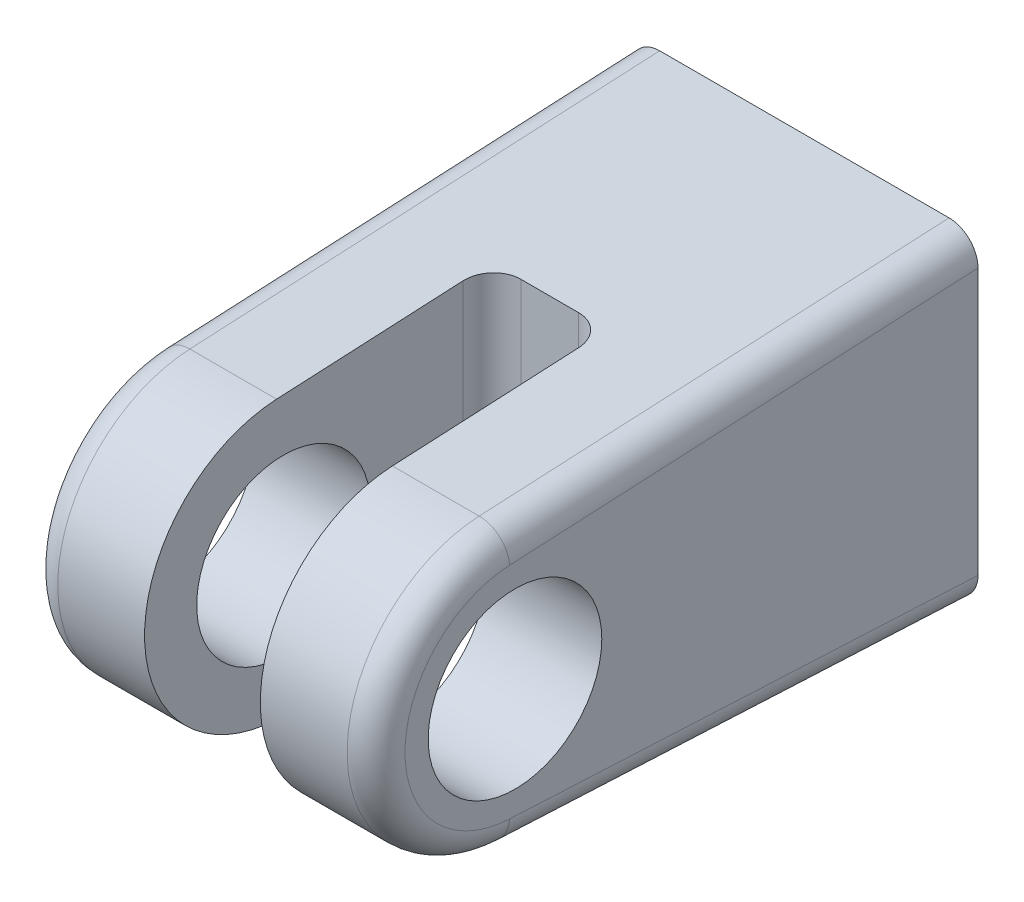
ISO-10303-21;
HEADER;
FILE_DESCRIPTION(('STEP AP214'),'2;1');
FILE_NAME('part.step','',(''),(''),'','','');
FILE_SCHEMA(('AUTOMOTIVE_DESIGN { 1 0 10303 214 1 1 1 1 }'));
ENDSEC;
DATA;
#1=APPLICATION_CONTEXT('core data for automotive mechanical design processes');
#2=APPLICATION_PROTOCOL_DEFINITION('international standard','automotive_design',2000,#1);
#3=PRODUCT_CONTEXT('',#1,'mechanical');
#4=PRODUCT('Part','Part','',(#3));
#5=PRODUCT_RELATED_PRODUCT_CATEGORY('part','',(#4));
#6=PRODUCT_DEFINITION_FORMATION('','',#4);
#7=PRODUCT_DEFINITION_CONTEXT('part definition',#1,'design');
#8=PRODUCT_DEFINITION('design','',#6,#7);
#9=PRODUCT_DEFINITION_SHAPE('','',#8);
#10=(LENGTH_UNIT() NAMED_UNIT(*) SI_UNIT(.MILLI.,.METRE.));
#11=(NAMED_UNIT(*) PLANE_ANGLE_UNIT() SI_UNIT($,.RADIAN.));
#12=(NAMED_UNIT(*) SI_UNIT($,.STERADIAN.) SOLID_ANGLE_UNIT());
#13=UNCERTAINTY_MEASURE_WITH_UNIT(LENGTH_MEASURE(1.E-05),#10,'distance_accuracy_value','');
#14=(GEOMETRIC_REPRESENTATION_CONTEXT(3) GLOBAL_UNCERTAINTY_ASSIGNED_CONTEXT((#13)) GLOBAL_UNIT_ASSIGNED_CONTEXT((#10,
#11,#12)) REPRESENTATION_CONTEXT('',''));
#15=CARTESIAN_POINT('',(0.,0.,0.));
#16=DIRECTION('',(0.,0.,1.));
#17=DIRECTION('',(1.,0.,0.));
#18=AXIS2_PLACEMENT_3D('',#15,#16,#17);
#19=CARTESIAN_POINT('',(9.525,0.,25.4));
#20=DIRECTION('',(-1.,0.,0.));
#21=DIRECTION('',(0.,0.,1.));
#22=AXIS2_PLACEMENT_3D('',#19,#20,#21);
#23=CYLINDRICAL_SURFACE('',#22,7.62);
#24=DIRECTION('',(-1.,0.,0.));
#25=VECTOR('',#24,1.);
#26=CARTESIAN_POINT('',(9.525,-7.61063246853942,25.7777213639888));
#27=LINE('',#26,#25);
#28=CARTESIAN_POINT('',(7.9375,-7.61063246853942,25.7777213639888));
#29=VERTEX_POINT('',#28);
#30=CARTESIAN_POINT('',(3.175,-7.61063246853942,25.7777213639888));
#31=VERTEX_POINT('',#30);
#32=EDGE_CURVE('E137',#29,#31,#27,.T.);
#33=ORIENTED_EDGE('',*,*,#32,.F.);
#34=CARTESIAN_POINT('',(7.9375,0.,25.4));
#35=DIRECTION('',(1.,0.,0.));
#36=DIRECTION('',(0.,0.,-1.));
#37=AXIS2_PLACEMENT_3D('',#34,#35,#36);
#38=CIRCLE('',#37,7.62);
#39=CARTESIAN_POINT('',(7.9375,7.61063246853942,25.7777213639888));
#40=VERTEX_POINT('',#39);
#41=EDGE_CURVE('E205',#29,#40,#38,.F.);
#42=ORIENTED_EDGE('',*,*,#41,.T.);
#43=DIRECTION('',(-1.,0.,0.));
#44=VECTOR('',#43,1.);
#45=CARTESIAN_POINT('',(9.525,7.61063246853942,25.7777213639888));
#46=LINE('',#45,#44);
#47=CARTESIAN_POINT('',(3.175,7.61063246853942,25.7777213639888));
#48=VERTEX_POINT('',#47);
#49=EDGE_CURVE('E156',#40,#48,#46,.T.);
#50=ORIENTED_EDGE('',*,*,#49,.T.);
#51=CARTESIAN_POINT('',(3.175,0.,25.4));
#52=DIRECTION('',(1.,0.,0.));
#53=DIRECTION('',(0.,0.,-1.));
#54=AXIS2_PLACEMENT_3D('',#51,#52,#53);
#55=CIRCLE('',#54,7.62);
#56=EDGE_CURVE('E154',#48,#31,#55,.T.);
#57=ORIENTED_EDGE('',*,*,#56,.T.);
#58=EDGE_LOOP('',(#33,#42,#50,#57));
#59=FACE_BOUND('',#58,.T.);
#60=ADVANCED_FACE('F36',(#59),#23,.T.);
#61=CARTESIAN_POINT('',(9.525,8.89,0.));
#62=DIRECTION('',(0.,0.,1.));
#63=DIRECTION('',(0.,-1.,0.));
#64=AXIS2_PLACEMENT_3D('',#61,#62,#63);
#65=PLANE('',#64);
#66=CARTESIAN_POINT('',(0.,0.,0.));
#67=DIRECTION('',(0.,0.,-1.));
#68=DIRECTION('',(0.,1.,0.));
#69=AXIS2_PLACEMENT_3D('',#66,#67,#68);
#70=CIRCLE('',#69,6.35);
#71=CARTESIAN_POINT('',(0.,6.35,0.));
#72=VERTEX_POINT('',#71);
#73=EDGE_CURVE('E229',#72,#72,#70,.T.);
#74=ORIENTED_EDGE('',*,*,#73,.F.);
#75=EDGE_LOOP('',(#74));
#76=FACE_BOUND('',#75,.T.);
#77=DIRECTION('',(-1.,0.,0.));
#78=VECTOR('',#77,1.);
#79=CARTESIAN_POINT('',(9.525,-8.89,0.));
#80=LINE('',#79,#78);
#81=CARTESIAN_POINT('',(7.9375,-8.89,0.));
#82=VERTEX_POINT('',#81);
#83=CARTESIAN_POINT('',(-7.93749999999999,-8.89,0.));
#84=VERTEX_POINT('',#83);
#85=EDGE_CURVE('E272',#82,#84,#80,.T.);
#86=ORIENTED_EDGE('',*,*,#85,.T.);
#87=CARTESIAN_POINT('',(-7.9375,-7.30054602886092,0.));
#88=DIRECTION('',(0.,0.,1.));
#89=DIRECTION('',(0.,-1.,0.));
#90=AXIS2_PLACEMENT_3D('',#87,#88,#89);
#91=ELLIPSE('',#90,1.58945397113908,1.5875);
#92=CARTESIAN_POINT('',(-9.525,-7.30054602886092,0.));
#93=VERTEX_POINT('',#92);
#94=EDGE_CURVE('E188',#84,#93,#91,.F.);
#95=ORIENTED_EDGE('',*,*,#94,.T.);
#96=DIRECTION('',(0.,1.,0.));
#97=VECTOR('',#96,1.);
#98=CARTESIAN_POINT('',(-9.525,8.89,0.));
#99=LINE('',#98,#97);
#100=CARTESIAN_POINT('',(-9.525,7.30054602886092,0.));
#101=VERTEX_POINT('',#100);
#102=EDGE_CURVE('E256',#93,#101,#99,.T.);
#103=ORIENTED_EDGE('',*,*,#102,.T.);
#104=CARTESIAN_POINT('',(-7.9375,7.30054602886092,0.));
#105=DIRECTION('',(0.,0.,1.));
#106=DIRECTION('',(0.,-1.,0.));
#107=AXIS2_PLACEMENT_3D('',#104,#105,#106);
#108=ELLIPSE('',#107,1.58945397113908,1.5875);
#109=CARTESIAN_POINT('',(-7.93749999999999,8.89,0.));
#110=VERTEX_POINT('',#109);
#111=EDGE_CURVE('E184',#101,#110,#108,.F.);
#112=ORIENTED_EDGE('',*,*,#111,.T.);
#113=DIRECTION('',(-1.,0.,0.));
#114=VECTOR('',#113,1.);
#115=CARTESIAN_POINT('',(9.525,8.89,0.));
#116=LINE('',#115,#114);
#117=CARTESIAN_POINT('',(7.9375,8.89,0.));
#118=VERTEX_POINT('',#117);
#119=EDGE_CURVE('E164',#118,#110,#116,.T.);
#120=ORIENTED_EDGE('',*,*,#119,.F.);
#121=CARTESIAN_POINT('',(7.9375,7.30054602886092,0.));
#122=DIRECTION('',(0.,0.,1.));
#123=DIRECTION('',(0.,1.,0.));
#124=AXIS2_PLACEMENT_3D('',#121,#122,#123);
#125=ELLIPSE('',#124,1.58945397113908,1.5875);
#126=CARTESIAN_POINT('',(9.525,7.30054602886092,0.));
#127=VERTEX_POINT('',#126);
#128=EDGE_CURVE('E182',#118,#127,#125,.F.);
#129=ORIENTED_EDGE('',*,*,#128,.T.);
#130=DIRECTION('',(0.,1.,0.));
#131=VECTOR('',#130,1.);
#132=CARTESIAN_POINT('',(9.525,8.89,0.));
#133=LINE('',#132,#131);
#134=CARTESIAN_POINT('',(9.525,-7.30054602886092,0.));
#135=VERTEX_POINT('',#134);
#136=EDGE_CURVE('E274',#135,#127,#133,.T.);
#137=ORIENTED_EDGE('',*,*,#136,.F.);
#138=CARTESIAN_POINT('',(7.9375,-7.30054602886092,0.));
#139=DIRECTION('',(0.,0.,1.));
#140=DIRECTION('',(0.,1.,0.));
#141=AXIS2_PLACEMENT_3D('',#138,#139,#140);
#142=ELLIPSE('',#141,1.58945397113908,1.5875);
#143=EDGE_CURVE('E186',#135,#82,#142,.F.);
#144=ORIENTED_EDGE('',*,*,#143,.T.);
#145=EDGE_LOOP('',(#86,#95,#103,#112,#120,#129,#137,#144));
#146=FACE_BOUND('',#145,.T.);
#147=ADVANCED_FACE('F250',(#76,#146),#65,.F.);
#148=CARTESIAN_POINT('',(9.525,8.89,0.));
#149=DIRECTION('',(0.,-0.998770665162654,-0.0495697328069288));
#150=DIRECTION('',(0.,0.0495697328069289,-0.998770665162654));
#151=AXIS2_PLACEMENT_3D('',#148,#149,#150);
#152=PLANE('',#151);
#153=ORIENTED_EDGE('',*,*,#119,.T.);
#154=DIRECTION('',(0.,-0.0495697328069289,0.998770665162654));
#155=VECTOR('',#154,1.);
#156=CARTESIAN_POINT('',(-7.9375,8.89,0.));
#157=LINE('',#156,#155);
#158=CARTESIAN_POINT('',(-7.93749999999999,7.61063246853942,25.7777213639888));
#159=VERTEX_POINT('',#158);
#160=EDGE_CURVE('E217',#110,#159,#157,.T.);
#161=ORIENTED_EDGE('',*,*,#160,.T.);
#162=CARTESIAN_POINT('',(-3.175,7.61063246853942,25.7777213639888));
#163=VERTEX_POINT('',#162);
#164=EDGE_CURVE('E149',#163,#159,#46,.T.);
#165=ORIENTED_EDGE('',*,*,#164,.F.);
#166=DIRECTION('',(0.,0.0495697328069289,-0.998770665162654));
#167=VECTOR('',#166,1.);
#168=CARTESIAN_POINT('',(-3.17500000000001,8.89,0.));
#169=LINE('',#168,#167);
#170=CARTESIAN_POINT('',(-3.175,8.11786967514889,15.5575));
#171=VERTEX_POINT('',#170);
#172=EDGE_CURVE('E276',#163,#171,#169,.T.);
#173=ORIENTED_EDGE('',*,*,#172,.T.);
#174=CARTESIAN_POINT('',(-1.5875,8.11786967514889,15.5575));
#175=DIRECTION('',(0.,-0.998770665162654,-0.0495697328069288));
#176=DIRECTION('',(0.,-0.0495697328069289,0.998770665162654));
#177=AXIS2_PLACEMENT_3D('',#174,#175,#176);
#178=ELLIPSE('',#177,1.58945397113908,1.5875);
#179=CARTESIAN_POINT('',(-1.5875,8.19665848380717,13.97));
#180=VERTEX_POINT('',#179);
#181=EDGE_CURVE('E219',#171,#180,#178,.T.);
#182=ORIENTED_EDGE('',*,*,#181,.T.);
#183=DIRECTION('',(1.,0.,0.));
#184=VECTOR('',#183,1.);
#185=CARTESIAN_POINT('',(9.525,8.19665848380717,13.97));
#186=LINE('',#185,#184);
#187=CARTESIAN_POINT('',(1.5875,8.19665848380717,13.97));
#188=VERTEX_POINT('',#187);
#189=EDGE_CURVE('E280',#180,#188,#186,.T.);
#190=ORIENTED_EDGE('',*,*,#189,.T.);
#191=CARTESIAN_POINT('',(1.5875,8.11786967514889,15.5575));
#192=DIRECTION('',(0.,-0.998770665162654,-0.0495697328069288));
#193=DIRECTION('',(0.,-0.0495697328069289,0.998770665162654));
#194=AXIS2_PLACEMENT_3D('',#191,#192,#193);
#195=ELLIPSE('',#194,1.58945397113908,1.5875);
#196=CARTESIAN_POINT('',(3.175,8.11786967514889,15.5575));
#197=VERTEX_POINT('',#196);
#198=EDGE_CURVE('E45',#188,#197,#195,.T.);
#199=ORIENTED_EDGE('',*,*,#198,.T.);
#200=DIRECTION('',(0.,-0.0495697328069289,0.998770665162654));
#201=VECTOR('',#200,1.);
#202=CARTESIAN_POINT('',(3.175,8.89,0.));
#203=LINE('',#202,#201);
#204=EDGE_CURVE('E158',#197,#48,#203,.T.);
#205=ORIENTED_EDGE('',*,*,#204,.T.);
#206=ORIENTED_EDGE('',*,*,#49,.F.);
#207=DIRECTION('',(0.,-0.0495697328069289,0.998770665162654));
#208=VECTOR('',#207,1.);
#209=CARTESIAN_POINT('',(7.9375,8.89,0.));
#210=LINE('',#209,#208);
#211=EDGE_CURVE('E215',#40,#118,#210,.F.);
#212=ORIENTED_EDGE('',*,*,#211,.T.);
#213=EDGE_LOOP('',(#153,#161,#165,#173,#182,#190,#199,#205,#206,#212));
#214=FACE_BOUND('',#213,.T.);
#215=ADVANCED_FACE('F246',(#214),#152,.F.);
#216=ORIENTED_EDGE('',*,*,#164,.T.);
#217=CARTESIAN_POINT('',(-7.9375,0.,25.4));
#218=DIRECTION('',(1.,0.,0.));
#219=DIRECTION('',(0.,0.,-1.));
#220=AXIS2_PLACEMENT_3D('',#217,#218,#219);
#221=CIRCLE('',#220,7.62);
#222=CARTESIAN_POINT('',(-7.93749999999999,-7.61063246853942,25.7777213639888));
#223=VERTEX_POINT('',#222);
#224=EDGE_CURVE('E196',#159,#223,#221,.T.);
#225=ORIENTED_EDGE('',*,*,#224,.T.);
#226=CARTESIAN_POINT('',(-3.175,-7.61063246853942,25.7777213639888));
#227=VERTEX_POINT('',#226);
#228=EDGE_CURVE('E150',#227,#223,#27,.T.);
#229=ORIENTED_EDGE('',*,*,#228,.F.);
#230=CARTESIAN_POINT('',(-3.175,0.,25.4));
#231=DIRECTION('',(-1.,0.,0.));
#232=DIRECTION('',(0.,0.,1.));
#233=AXIS2_PLACEMENT_3D('',#230,#231,#232);
#234=CIRCLE('',#233,7.62);
#235=EDGE_CURVE('E270',#227,#163,#234,.T.);
#236=ORIENTED_EDGE('',*,*,#235,.T.);
#237=EDGE_LOOP('',(#216,#225,#229,#236));
#238=FACE_BOUND('',#237,.T.);
#239=ADVANCED_FACE('F267',(#238),#23,.T.);
#240=CARTESIAN_POINT('',(9.525,-8.89,0.));
#241=DIRECTION('',(0.,0.998770665162654,-0.0495697328069286));
#242=DIRECTION('',(0.,0.0495697328069286,0.998770665162654));
#243=AXIS2_PLACEMENT_3D('',#240,#241,#242);
#244=PLANE('',#243);
#245=ORIENTED_EDGE('',*,*,#228,.T.);
#246=DIRECTION('',(0.,-0.0495697328069286,-0.998770665162654));
#247=VECTOR('',#246,1.);
#248=CARTESIAN_POINT('',(-7.9375,-8.89,0.));
#249=LINE('',#248,#247);
#250=EDGE_CURVE('E179',#223,#84,#249,.T.);
#251=ORIENTED_EDGE('',*,*,#250,.T.);
#252=ORIENTED_EDGE('',*,*,#85,.F.);
#253=DIRECTION('',(0.,-0.0495697328069286,-0.998770665162654));
#254=VECTOR('',#253,1.);
#255=CARTESIAN_POINT('',(7.9375,-7.61063246853942,25.7777213639888));
#256=LINE('',#255,#254);
#257=EDGE_CURVE('E146',#82,#29,#256,.F.);
#258=ORIENTED_EDGE('',*,*,#257,.T.);
#259=ORIENTED_EDGE('',*,*,#32,.T.);
#260=DIRECTION('',(0.,-0.0495697328069286,-0.998770665162654));
#261=VECTOR('',#260,1.);
#262=CARTESIAN_POINT('',(3.175,-8.89,0.));
#263=LINE('',#262,#261);
#264=CARTESIAN_POINT('',(3.175,-8.1178696751489,15.5575));
#265=VERTEX_POINT('',#264);
#266=EDGE_CURVE('E142',#31,#265,#263,.T.);
#267=ORIENTED_EDGE('',*,*,#266,.T.);
#268=CARTESIAN_POINT('',(1.5875,-8.1178696751489,15.5575));
#269=DIRECTION('',(0.,0.998770665162654,-0.0495697328069286));
#270=DIRECTION('',(0.,-0.0495697328069286,-0.998770665162654));
#271=AXIS2_PLACEMENT_3D('',#268,#269,#270);
#272=ELLIPSE('',#271,1.58945397113908,1.5875);
#273=CARTESIAN_POINT('',(1.5875,-8.19665848380717,13.97));
#274=VERTEX_POINT('',#273);
#275=EDGE_CURVE('E11',#265,#274,#272,.T.);
#276=ORIENTED_EDGE('',*,*,#275,.T.);
#277=DIRECTION('',(-1.,0.,0.));
#278=VECTOR('',#277,1.);
#279=CARTESIAN_POINT('',(9.525,-8.19665848380717,13.97));
#280=LINE('',#279,#278);
#281=CARTESIAN_POINT('',(-1.5875,-8.19665848380717,13.97));
#282=VERTEX_POINT('',#281);
#283=EDGE_CURVE('E163',#274,#282,#280,.T.);
#284=ORIENTED_EDGE('',*,*,#283,.T.);
#285=CARTESIAN_POINT('',(-1.5875,-8.1178696751489,15.5575));
#286=DIRECTION('',(0.,0.998770665162654,-0.0495697328069286));
#287=DIRECTION('',(0.,-0.0495697328069286,-0.998770665162654));
#288=AXIS2_PLACEMENT_3D('',#285,#286,#287);
#289=ELLIPSE('',#288,1.58945397113908,1.5875);
#290=CARTESIAN_POINT('',(-3.175,-8.1178696751489,15.5575));
#291=VERTEX_POINT('',#290);
#292=EDGE_CURVE('E221',#282,#291,#289,.T.);
#293=ORIENTED_EDGE('',*,*,#292,.T.);
#294=DIRECTION('',(0.,0.0495697328069286,0.998770665162654));
#295=VECTOR('',#294,1.);
#296=CARTESIAN_POINT('',(-3.17500000000001,-8.89,0.));
#297=LINE('',#296,#295);
#298=EDGE_CURVE('E167',#291,#227,#297,.T.);
#299=ORIENTED_EDGE('',*,*,#298,.T.);
#300=EDGE_LOOP('',(#245,#251,#252,#258,#259,#267,#276,#284,#293,#299));
#301=FACE_BOUND('',#300,.T.);
#302=ADVANCED_FACE('F140',(#301),#244,.F.);
#303=CARTESIAN_POINT('',(9.525,0.,25.4));
#304=DIRECTION('',(1.,0.,0.));
#305=DIRECTION('',(0.,0.,-1.));
#306=AXIS2_PLACEMENT_3D('',#303,#304,#305);
#307=PLANE('',#306);
#308=CARTESIAN_POINT('',(9.525,0.,25.4));
#309=DIRECTION('',(1.,0.,0.));
#310=DIRECTION('',(0.,0.,-1.));
#311=AXIS2_PLACEMENT_3D('',#308,#309,#310);
#312=CIRCLE('',#311,4.7625);
#313=CARTESIAN_POINT('',(9.525,0.,20.6375));
#314=VERTEX_POINT('',#313);
#315=EDGE_CURVE('E285',#314,#314,#312,.T.);
#316=ORIENTED_EDGE('',*,*,#315,.F.);
#317=EDGE_LOOP('',(#316));
#318=FACE_BOUND('',#317,.T.);
#319=CARTESIAN_POINT('',(9.525,0.,25.4));
#320=DIRECTION('',(1.,0.,0.));
#321=DIRECTION('',(0.,0.,-1.));
#322=AXIS2_PLACEMENT_3D('',#319,#320,#321);
#323=CIRCLE('',#322,6.0325);
#324=CARTESIAN_POINT('',(9.525,6.0250840375937,25.6990294131578));
#325=VERTEX_POINT('',#324);
#326=CARTESIAN_POINT('',(9.525,-6.02508403759371,25.6990294131578));
#327=VERTEX_POINT('',#326);
#328=EDGE_CURVE('E200',#325,#327,#323,.T.);
#329=ORIENTED_EDGE('',*,*,#328,.T.);
#330=DIRECTION('',(0.,-0.0495697328069286,-0.998770665162654));
#331=VECTOR('',#330,1.);
#332=CARTESIAN_POINT('',(9.525,-7.30445156905429,-0.0786919508310134));
#333=LINE('',#332,#331);
#334=EDGE_CURVE('E202',#327,#135,#333,.T.);
#335=ORIENTED_EDGE('',*,*,#334,.T.);
#336=ORIENTED_EDGE('',*,*,#136,.T.);
#337=DIRECTION('',(0.,-0.0495697328069289,0.998770665162654));
#338=VECTOR('',#337,1.);
#339=CARTESIAN_POINT('',(9.525,6.0250840375937,25.6990294131578));
#340=LINE('',#339,#338);
#341=EDGE_CURVE('E198',#127,#325,#340,.T.);
#342=ORIENTED_EDGE('',*,*,#341,.T.);
#343=EDGE_LOOP('',(#329,#335,#336,#342));
#344=FACE_BOUND('',#343,.T.);
#345=ADVANCED_FACE('F350',(#318,#344),#307,.T.);
#346=CARTESIAN_POINT('',(-9.525,0.,25.4));
#347=DIRECTION('',(1.,0.,0.));
#348=DIRECTION('',(0.,0.,-1.));
#349=AXIS2_PLACEMENT_3D('',#346,#347,#348);
#350=PLANE('',#349);
#351=CARTESIAN_POINT('',(-9.525,0.,25.4));
#352=DIRECTION('',(1.,0.,0.));
#353=DIRECTION('',(0.,0.,-1.));
#354=AXIS2_PLACEMENT_3D('',#351,#352,#353);
#355=CIRCLE('',#354,4.7625);
#356=CARTESIAN_POINT('',(-9.525,0.,20.6375));
#357=VERTEX_POINT('',#356);
#358=EDGE_CURVE('E177',#357,#357,#355,.T.);
#359=ORIENTED_EDGE('',*,*,#358,.T.);
#360=EDGE_LOOP('',(#359));
#361=FACE_BOUND('',#360,.T.);
#362=ORIENTED_EDGE('',*,*,#102,.F.);
#363=DIRECTION('',(0.,-0.0495697328069286,-0.998770665162654));
#364=VECTOR('',#363,1.);
#365=CARTESIAN_POINT('',(-9.525,-6.02508403759371,25.6990294131578));
#366=LINE('',#365,#364);
#367=CARTESIAN_POINT('',(-9.525,-6.02508403759371,25.6990294131578));
#368=VERTEX_POINT('',#367);
#369=EDGE_CURVE('E194',#93,#368,#366,.F.);
#370=ORIENTED_EDGE('',*,*,#369,.T.);
#371=CARTESIAN_POINT('',(-9.525,0.,25.4));
#372=DIRECTION('',(1.,0.,0.));
#373=DIRECTION('',(0.,0.,-1.));
#374=AXIS2_PLACEMENT_3D('',#371,#372,#373);
#375=CIRCLE('',#374,6.0325);
#376=CARTESIAN_POINT('',(-9.525,6.02508403759371,25.6990294131578));
#377=VERTEX_POINT('',#376);
#378=EDGE_CURVE('E192',#368,#377,#375,.F.);
#379=ORIENTED_EDGE('',*,*,#378,.T.);
#380=DIRECTION('',(0.,-0.0495697328069289,0.998770665162654));
#381=VECTOR('',#380,1.);
#382=CARTESIAN_POINT('',(-9.525,6.0250840375937,25.6990294131578));
#383=LINE('',#382,#381);
#384=EDGE_CURVE('E190',#377,#101,#383,.F.);
#385=ORIENTED_EDGE('',*,*,#384,.T.);
#386=EDGE_LOOP('',(#362,#370,#379,#385));
#387=FACE_BOUND('',#386,.T.);
#388=ADVANCED_FACE('F348',(#361,#387),#350,.F.);
#389=CARTESIAN_POINT('',(-3.175,-8.89,13.97));
#390=DIRECTION('',(-1.,0.,0.));
#391=DIRECTION('',(0.,0.,1.));
#392=AXIS2_PLACEMENT_3D('',#389,#390,#391);
#393=PLANE('',#392);
#394=CARTESIAN_POINT('',(-3.175,0.,25.4));
#395=DIRECTION('',(-1.,0.,0.));
#396=DIRECTION('',(0.,0.,1.));
#397=AXIS2_PLACEMENT_3D('',#394,#395,#396);
#398=CIRCLE('',#397,4.7625);
#399=CARTESIAN_POINT('',(-3.175,0.,20.6375));
#400=VERTEX_POINT('',#399);
#401=EDGE_CURVE('E159',#400,#400,#398,.T.);
#402=ORIENTED_EDGE('',*,*,#401,.T.);
#403=EDGE_LOOP('',(#402));
#404=FACE_BOUND('',#403,.T.);
#405=ORIENTED_EDGE('',*,*,#298,.F.);
#406=DIRECTION('',(0.,1.,0.));
#407=VECTOR('',#406,1.);
#408=CARTESIAN_POINT('',(-3.175,8.19665848380717,15.5575));
#409=LINE('',#408,#407);
#410=EDGE_CURVE('E207',#291,#171,#409,.T.);
#411=ORIENTED_EDGE('',*,*,#410,.T.);
#412=ORIENTED_EDGE('',*,*,#172,.F.);
#413=ORIENTED_EDGE('',*,*,#235,.F.);
#414=EDGE_LOOP('',(#405,#411,#412,#413));
#415=FACE_BOUND('',#414,.T.);
#416=ADVANCED_FACE('F342',(#404,#415),#393,.F.);
#417=CARTESIAN_POINT('',(-3.175,-8.89,13.97));
#418=DIRECTION('',(0.,0.,-1.));
#419=DIRECTION('',(-1.,0.,0.));
#420=AXIS2_PLACEMENT_3D('',#417,#418,#419);
#421=PLANE('',#420);
#422=ORIENTED_EDGE('',*,*,#189,.F.);
#423=DIRECTION('',(0.,1.,0.));
#424=VECTOR('',#423,1.);
#425=CARTESIAN_POINT('',(-1.5875,-8.19665848380717,13.97));
#426=LINE('',#425,#424);
#427=EDGE_CURVE('E212',#180,#282,#426,.F.);
#428=ORIENTED_EDGE('',*,*,#427,.T.);
#429=ORIENTED_EDGE('',*,*,#283,.F.);
#430=DIRECTION('',(0.,1.,0.));
#431=VECTOR('',#430,1.);
#432=CARTESIAN_POINT('',(1.5875,8.19665848380717,13.97));
#433=LINE('',#432,#431);
#434=EDGE_CURVE('E210',#274,#188,#433,.T.);
#435=ORIENTED_EDGE('',*,*,#434,.T.);
#436=EDGE_LOOP('',(#422,#428,#429,#435));
#437=FACE_BOUND('',#436,.T.);
#438=ADVANCED_FACE('F357',(#437),#421,.F.);
#439=CARTESIAN_POINT('',(3.175,-8.89,13.97));
#440=DIRECTION('',(1.,0.,0.));
#441=DIRECTION('',(0.,0.,-1.));
#442=AXIS2_PLACEMENT_3D('',#439,#440,#441);
#443=PLANE('',#442);
#444=CARTESIAN_POINT('',(3.175,0.,25.4));
#445=DIRECTION('',(1.,0.,0.));
#446=DIRECTION('',(0.,0.,-1.));
#447=AXIS2_PLACEMENT_3D('',#444,#445,#446);
#448=CIRCLE('',#447,4.7625);
#449=CARTESIAN_POINT('',(3.175,0.,20.6375));
#450=VERTEX_POINT('',#449);
#451=EDGE_CURVE('E174',#450,#450,#448,.T.);
#452=ORIENTED_EDGE('',*,*,#451,.T.);
#453=EDGE_LOOP('',(#452));
#454=FACE_BOUND('',#453,.T.);
#455=ORIENTED_EDGE('',*,*,#204,.F.);
#456=DIRECTION('',(0.,1.,0.));
#457=VECTOR('',#456,1.);
#458=CARTESIAN_POINT('',(3.175,-8.19665848380717,15.5575));
#459=LINE('',#458,#457);
#460=EDGE_CURVE('E162',#197,#265,#459,.F.);
#461=ORIENTED_EDGE('',*,*,#460,.T.);
#462=ORIENTED_EDGE('',*,*,#266,.F.);
#463=ORIENTED_EDGE('',*,*,#56,.F.);
#464=EDGE_LOOP('',(#455,#461,#462,#463));
#465=FACE_BOUND('',#464,.T.);
#466=ADVANCED_FACE('F161',(#454,#465),#443,.F.);
#467=CARTESIAN_POINT('',(-9.525,0.,25.4));
#468=DIRECTION('',(1.,0.,0.));
#469=DIRECTION('',(0.,0.,-1.));
#470=AXIS2_PLACEMENT_3D('',#467,#468,#469);
#471=CYLINDRICAL_SURFACE('',#470,4.7625);
#472=CARTESIAN_POINT('',(9.525,0.,20.6375));
#473=CARTESIAN_POINT('',(9.45885416666667,0.,20.6375));
#474=CARTESIAN_POINT('',(9.39270833333333,0.,20.6375));
#475=CARTESIAN_POINT('',(9.26041666666667,0.,20.6375));
#476=CARTESIAN_POINT('',(9.19427083333333,0.,20.6375));
#477=CARTESIAN_POINT('',(9.06197916666667,0.,20.6375));
#478=CARTESIAN_POINT('',(8.99583333333333,0.,20.6375));
#479=CARTESIAN_POINT('',(8.86354166666667,0.,20.6375));
#480=CARTESIAN_POINT('',(8.79739583333333,0.,20.6375));
#481=CARTESIAN_POINT('',(8.66510416666667,0.,20.6375));
#482=CARTESIAN_POINT('',(8.59895833333333,0.,20.6375));
#483=CARTESIAN_POINT('',(8.46666666666667,0.,20.6375));
#484=CARTESIAN_POINT('',(8.40052083333333,0.,20.6375));
#485=CARTESIAN_POINT('',(8.26822916666667,0.,20.6375));
#486=CARTESIAN_POINT('',(8.20208333333333,0.,20.6375));
#487=CARTESIAN_POINT('',(8.06979166666667,0.,20.6375));
#488=CARTESIAN_POINT('',(8.00364583333333,0.,20.6375));
#489=CARTESIAN_POINT('',(7.87135416666667,0.,20.6375));
#490=CARTESIAN_POINT('',(7.80520833333333,0.,20.6375));
#491=CARTESIAN_POINT('',(7.67291666666667,0.,20.6375));
#492=CARTESIAN_POINT('',(7.60677083333333,0.,20.6375));
#493=CARTESIAN_POINT('',(7.47447916666666,0.,20.6375));
#494=CARTESIAN_POINT('',(7.40833333333333,0.,20.6375));
#495=CARTESIAN_POINT('',(7.27604166666667,0.,20.6375));
#496=CARTESIAN_POINT('',(7.20989583333333,0.,20.6375));
#497=CARTESIAN_POINT('',(7.07760416666667,0.,20.6375));
#498=CARTESIAN_POINT('',(7.01145833333333,0.,20.6375));
#499=CARTESIAN_POINT('',(6.87916666666666,0.,20.6375));
#500=CARTESIAN_POINT('',(6.81302083333333,0.,20.6375));
#501=CARTESIAN_POINT('',(6.68072916666666,0.,20.6375));
#502=CARTESIAN_POINT('',(6.61458333333333,0.,20.6375));
#503=CARTESIAN_POINT('',(6.48229166666667,0.,20.6375));
#504=CARTESIAN_POINT('',(6.41614583333333,0.,20.6375));
#505=CARTESIAN_POINT('',(6.28385416666666,0.,20.6375));
#506=CARTESIAN_POINT('',(6.21770833333333,0.,20.6375));
#507=CARTESIAN_POINT('',(6.08541666666667,0.,20.6375));
#508=CARTESIAN_POINT('',(6.01927083333333,0.,20.6375));
#509=CARTESIAN_POINT('',(5.88697916666667,0.,20.6375));
#510=CARTESIAN_POINT('',(5.82083333333333,0.,20.6375));
#511=CARTESIAN_POINT('',(5.68854166666667,0.,20.6375));
#512=CARTESIAN_POINT('',(5.62239583333333,0.,20.6375));
#513=CARTESIAN_POINT('',(5.49010416666667,0.,20.6375));
#514=CARTESIAN_POINT('',(5.42395833333333,0.,20.6375));
#515=CARTESIAN_POINT('',(5.29166666666667,0.,20.6375));
#516=CARTESIAN_POINT('',(5.22552083333333,0.,20.6375));
#517=CARTESIAN_POINT('',(5.09322916666667,0.,20.6375));
#518=CARTESIAN_POINT('',(5.02708333333333,0.,20.6375));
#519=CARTESIAN_POINT('',(4.89479166666667,0.,20.6375));
#520=CARTESIAN_POINT('',(4.82864583333333,0.,20.6375));
#521=CARTESIAN_POINT('',(4.69635416666667,0.,20.6375));
#522=CARTESIAN_POINT('',(4.63020833333333,0.,20.6375));
#523=CARTESIAN_POINT('',(4.49791666666667,0.,20.6375));
#524=CARTESIAN_POINT('',(4.43177083333333,0.,20.6375));
#525=CARTESIAN_POINT('',(4.29947916666667,0.,20.6375));
#526=CARTESIAN_POINT('',(4.23333333333333,0.,20.6375));
#527=CARTESIAN_POINT('',(4.10104166666667,0.,20.6375));
#528=CARTESIAN_POINT('',(4.03489583333333,0.,20.6375));
#529=CARTESIAN_POINT('',(3.90260416666667,0.,20.6375));
#530=CARTESIAN_POINT('',(3.83645833333333,0.,20.6375));
#531=CARTESIAN_POINT('',(3.70416666666666,0.,20.6375));
#532=CARTESIAN_POINT('',(3.63802083333333,0.,20.6375));
#533=CARTESIAN_POINT('',(3.50572916666666,0.,20.6375));
#534=CARTESIAN_POINT('',(3.43958333333333,0.,20.6375));
#535=CARTESIAN_POINT('',(3.30729166666666,0.,20.6375));
#536=CARTESIAN_POINT('',(3.24114583333333,0.,20.6375));
#537=CARTESIAN_POINT('',(3.175,0.,20.6375));
#538=B_SPLINE_CURVE_WITH_KNOTS('',3,(#472,#473,#474,#475,#476,#477,#478,#479,#480,#481,#482,
#483,#484,#485,#486,#487,#488,#489,#490,#491,#492,#493,#494,#495,#496,#497,#498,#499,#500,#501,
#502,#503,#504,#505,#506,#507,#508,#509,#510,#511,#512,#513,#514,#515,#516,#517,#518,#519,#520,
#521,#522,#523,#524,#525,#526,#527,#528,#529,#530,#531,#532,#533,#534,#535,#536,#537),
.UNSPECIFIED.,.F.,.F.,(4,2,2,2,2,2,2,2,2,2,2,2,2,2,2,2,2,2,2,2,2,2,2,2,2,2,2,2,2,2,2,2,4),(0.,
0.198437499999999,0.396875000000001,0.5953125,0.793749999999999,0.992187500000002,1.190625,
1.3890625,1.5875,1.7859375,1.984375,2.1828125,2.38125,2.5796875,2.778125,2.9765625,3.175,
3.3734375,3.571875,3.7703125,3.96875,4.1671875,4.365625,4.5640625,4.7625,4.9609375,5.159375,
5.3578125,5.55625,5.7546875,5.953125,6.1515625,6.35),.UNSPECIFIED.);
#539=EDGE_CURVE('BSEAM406',#314,#450,#538,.T.);
#540=ORIENTED_EDGE('',*,*,#315,.T.);
#541=ORIENTED_EDGE('',*,*,#451,.F.);
#542=ORIENTED_EDGE('',*,*,#539,.T.);
#543=ORIENTED_EDGE('',*,*,#539,.F.);
#544=EDGE_LOOP('',(#540,#542,#541,#543));
#545=FACE_BOUND('',#544,.T.);
#546=ADVANCED_FACE('F406',(#545),#471,.F.);
#547=CARTESIAN_POINT('',(-9.525,0.,20.6375));
#548=CARTESIAN_POINT('',(-9.45885416666667,0.,20.6375));
#549=CARTESIAN_POINT('',(-9.39270833333333,0.,20.6375));
#550=CARTESIAN_POINT('',(-9.26041666666667,0.,20.6375));
#551=CARTESIAN_POINT('',(-9.19427083333333,0.,20.6375));
#552=CARTESIAN_POINT('',(-9.06197916666667,0.,20.6375));
#553=CARTESIAN_POINT('',(-8.99583333333334,0.,20.6375));
#554=CARTESIAN_POINT('',(-8.86354166666667,0.,20.6375));
#555=CARTESIAN_POINT('',(-8.79739583333333,0.,20.6375));
#556=CARTESIAN_POINT('',(-8.66510416666667,0.,20.6375));
#557=CARTESIAN_POINT('',(-8.59895833333334,0.,20.6375));
#558=CARTESIAN_POINT('',(-8.46666666666667,0.,20.6375));
#559=CARTESIAN_POINT('',(-8.40052083333333,0.,20.6375));
#560=CARTESIAN_POINT('',(-8.26822916666667,0.,20.6375));
#561=CARTESIAN_POINT('',(-8.20208333333333,0.,20.6375));
#562=CARTESIAN_POINT('',(-8.06979166666667,0.,20.6375));
#563=CARTESIAN_POINT('',(-8.00364583333334,0.,20.6375));
#564=CARTESIAN_POINT('',(-7.87135416666667,0.,20.6375));
#565=CARTESIAN_POINT('',(-7.80520833333333,0.,20.6375));
#566=CARTESIAN_POINT('',(-7.67291666666667,0.,20.6375));
#567=CARTESIAN_POINT('',(-7.60677083333333,0.,20.6375));
#568=CARTESIAN_POINT('',(-7.47447916666667,0.,20.6375));
#569=CARTESIAN_POINT('',(-7.40833333333333,0.,20.6375));
#570=CARTESIAN_POINT('',(-7.27604166666667,0.,20.6375));
#571=CARTESIAN_POINT('',(-7.20989583333333,0.,20.6375));
#572=CARTESIAN_POINT('',(-7.07760416666667,0.,20.6375));
#573=CARTESIAN_POINT('',(-7.01145833333333,0.,20.6375));
#574=CARTESIAN_POINT('',(-6.87916666666667,0.,20.6375));
#575=CARTESIAN_POINT('',(-6.81302083333333,0.,20.6375));
#576=CARTESIAN_POINT('',(-6.68072916666667,0.,20.6375));
#577=CARTESIAN_POINT('',(-6.61458333333333,0.,20.6375));
#578=CARTESIAN_POINT('',(-6.48229166666667,0.,20.6375));
#579=CARTESIAN_POINT('',(-6.41614583333333,0.,20.6375));
#580=CARTESIAN_POINT('',(-6.28385416666667,0.,20.6375));
#581=CARTESIAN_POINT('',(-6.21770833333333,0.,20.6375));
#582=CARTESIAN_POINT('',(-6.08541666666667,0.,20.6375));
#583=CARTESIAN_POINT('',(-6.01927083333333,0.,20.6375));
#584=CARTESIAN_POINT('',(-5.88697916666667,0.,20.6375));
#585=CARTESIAN_POINT('',(-5.82083333333333,0.,20.6375));
#586=CARTESIAN_POINT('',(-5.68854166666667,0.,20.6375));
#587=CARTESIAN_POINT('',(-5.62239583333333,0.,20.6375));
#588=CARTESIAN_POINT('',(-5.49010416666667,0.,20.6375));
#589=CARTESIAN_POINT('',(-5.42395833333333,0.,20.6375));
#590=CARTESIAN_POINT('',(-5.29166666666667,0.,20.6375));
#591=CARTESIAN_POINT('',(-5.22552083333333,0.,20.6375));
#592=CARTESIAN_POINT('',(-5.09322916666667,0.,20.6375));
#593=CARTESIAN_POINT('',(-5.02708333333333,0.,20.6375));
#594=CARTESIAN_POINT('',(-4.89479166666667,0.,20.6375));
#595=CARTESIAN_POINT('',(-4.82864583333333,0.,20.6375));
#596=CARTESIAN_POINT('',(-4.69635416666667,0.,20.6375));
#597=CARTESIAN_POINT('',(-4.63020833333333,0.,20.6375));
#598=CARTESIAN_POINT('',(-4.49791666666667,0.,20.6375));
#599=CARTESIAN_POINT('',(-4.43177083333333,0.,20.6375));
#600=CARTESIAN_POINT('',(-4.29947916666667,0.,20.6375));
#601=CARTESIAN_POINT('',(-4.23333333333333,0.,20.6375));
#602=CARTESIAN_POINT('',(-4.10104166666667,0.,20.6375));
#603=CARTESIAN_POINT('',(-4.03489583333333,0.,20.6375));
#604=CARTESIAN_POINT('',(-3.90260416666667,0.,20.6375));
#605=CARTESIAN_POINT('',(-3.83645833333334,0.,20.6375));
#606=CARTESIAN_POINT('',(-3.70416666666667,0.,20.6375));
#607=CARTESIAN_POINT('',(-3.63802083333333,0.,20.6375));
#608=CARTESIAN_POINT('',(-3.50572916666667,0.,20.6375));
#609=CARTESIAN_POINT('',(-3.43958333333333,0.,20.6375));
#610=CARTESIAN_POINT('',(-3.30729166666667,0.,20.6375));
#611=CARTESIAN_POINT('',(-3.24114583333334,0.,20.6375));
#612=CARTESIAN_POINT('',(-3.175,0.,20.6375));
#613=B_SPLINE_CURVE_WITH_KNOTS('',3,(#547,#548,#549,#550,#551,#552,#553,#554,#555,#556,#557,
#558,#559,#560,#561,#562,#563,#564,#565,#566,#567,#568,#569,#570,#571,#572,#573,#574,#575,#576,
#577,#578,#579,#580,#581,#582,#583,#584,#585,#586,#587,#588,#589,#590,#591,#592,#593,#594,#595,
#596,#597,#598,#599,#600,#601,#602,#603,#604,#605,#606,#607,#608,#609,#610,#611,#612),
.UNSPECIFIED.,.F.,.F.,(4,2,2,2,2,2,2,2,2,2,2,2,2,2,2,2,2,2,2,2,2,2,2,2,2,2,2,2,2,2,2,2,4),(0.,
0.198437499999999,0.396875,0.595312499999999,0.793749999999999,0.992187499999998,1.190625,
1.3890625,1.5875,1.7859375,1.984375,2.1828125,2.38125,2.5796875,2.778125,2.9765625,3.175,
3.3734375,3.571875,3.7703125,3.96875,4.1671875,4.365625,4.5640625,4.7625,4.9609375,5.159375,
5.3578125,5.55625,5.7546875,5.953125,6.1515625,6.35),.UNSPECIFIED.);
#614=EDGE_CURVE('BSEAM301',#357,#400,#613,.T.);
#615=ORIENTED_EDGE('',*,*,#358,.F.);
#616=ORIENTED_EDGE('',*,*,#401,.F.);
#617=ORIENTED_EDGE('',*,*,#614,.T.);
#618=ORIENTED_EDGE('',*,*,#614,.F.);
#619=EDGE_LOOP('',(#615,#617,#616,#618));
#620=FACE_BOUND('',#619,.T.);
#621=ADVANCED_FACE('F301',(#620),#471,.F.);
#622=CARTESIAN_POINT('',(0.,0.,9.525));
#623=DIRECTION('',(0.,0.,-1.));
#624=DIRECTION('',(0.,1.,0.));
#625=AXIS2_PLACEMENT_3D('',#622,#623,#624);
#626=CYLINDRICAL_SURFACE('',#625,6.35);
#627=CARTESIAN_POINT('',(0.,0.,9.525));
#628=DIRECTION('',(0.,0.,-1.));
#629=DIRECTION('',(0.,1.,0.));
#630=AXIS2_PLACEMENT_3D('',#627,#628,#629);
#631=CIRCLE('',#630,6.35);
#632=CARTESIAN_POINT('',(0.,6.35,9.525));
#633=VERTEX_POINT('',#632);
#634=EDGE_CURVE('E288',#633,#633,#631,.T.);
#635=CARTESIAN_POINT('',(0.,6.35,9.525));
#636=CARTESIAN_POINT('',(0.,6.35,9.42578125));
#637=CARTESIAN_POINT('',(0.,6.35,9.3265625));
#638=CARTESIAN_POINT('',(0.,6.35,9.128125));
#639=CARTESIAN_POINT('',(0.,6.35,9.02890625));
#640=CARTESIAN_POINT('',(0.,6.35,8.83046875));
#641=CARTESIAN_POINT('',(0.,6.35,8.73125));
#642=CARTESIAN_POINT('',(0.,6.35,8.5328125));
#643=CARTESIAN_POINT('',(0.,6.35,8.43359375));
#644=CARTESIAN_POINT('',(0.,6.35,8.23515625));
#645=CARTESIAN_POINT('',(0.,6.35,8.1359375));
#646=CARTESIAN_POINT('',(0.,6.35,7.9375));
#647=CARTESIAN_POINT('',(0.,6.35,7.83828125));
#648=CARTESIAN_POINT('',(0.,6.35,7.63984375));
#649=CARTESIAN_POINT('',(0.,6.35,7.540625));
#650=CARTESIAN_POINT('',(0.,6.35,7.3421875));
#651=CARTESIAN_POINT('',(0.,6.35,7.24296875));
#652=CARTESIAN_POINT('',(0.,6.35,7.04453125));
#653=CARTESIAN_POINT('',(0.,6.35,6.9453125));
#654=CARTESIAN_POINT('',(0.,6.35,6.746875));
#655=CARTESIAN_POINT('',(0.,6.35,6.64765625));
#656=CARTESIAN_POINT('',(0.,6.35,6.44921875));
#657=CARTESIAN_POINT('',(0.,6.35,6.35));
#658=CARTESIAN_POINT('',(0.,6.35,6.1515625));
#659=CARTESIAN_POINT('',(0.,6.35,6.05234375));
#660=CARTESIAN_POINT('',(0.,6.35,5.85390625));
#661=CARTESIAN_POINT('',(0.,6.35,5.7546875));
#662=CARTESIAN_POINT('',(0.,6.35,5.55625));
#663=CARTESIAN_POINT('',(0.,6.35,5.45703125));
#664=CARTESIAN_POINT('',(0.,6.35,5.25859375));
#665=CARTESIAN_POINT('',(0.,6.35,5.159375));
#666=CARTESIAN_POINT('',(0.,6.35,4.9609375));
#667=CARTESIAN_POINT('',(0.,6.35,4.86171875));
#668=CARTESIAN_POINT('',(0.,6.35,4.66328125));
#669=CARTESIAN_POINT('',(0.,6.35,4.5640625));
#670=CARTESIAN_POINT('',(0.,6.35,4.365625));
#671=CARTESIAN_POINT('',(0.,6.35,4.26640625));
#672=CARTESIAN_POINT('',(0.,6.35,4.06796875));
#673=CARTESIAN_POINT('',(0.,6.35,3.96875));
#674=CARTESIAN_POINT('',(0.,6.35,3.7703125));
#675=CARTESIAN_POINT('',(0.,6.35,3.67109375));
#676=CARTESIAN_POINT('',(0.,6.35,3.47265625));
#677=CARTESIAN_POINT('',(0.,6.35,3.3734375));
#678=CARTESIAN_POINT('',(0.,6.35,3.175));
#679=CARTESIAN_POINT('',(0.,6.35,3.07578125));
#680=CARTESIAN_POINT('',(0.,6.35,2.87734375));
#681=CARTESIAN_POINT('',(0.,6.35,2.778125));
#682=CARTESIAN_POINT('',(0.,6.35,2.5796875));
#683=CARTESIAN_POINT('',(0.,6.35,2.48046875));
#684=CARTESIAN_POINT('',(0.,6.35,2.28203125));
#685=CARTESIAN_POINT('',(0.,6.35,2.1828125));
#686=CARTESIAN_POINT('',(0.,6.35,1.984375));
#687=CARTESIAN_POINT('',(0.,6.35,1.88515625));
#688=CARTESIAN_POINT('',(0.,6.35,1.68671875));
#689=CARTESIAN_POINT('',(0.,6.35,1.5875));
#690=CARTESIAN_POINT('',(0.,6.35,1.3890625));
#691=CARTESIAN_POINT('',(0.,6.35,1.28984375));
#692=CARTESIAN_POINT('',(0.,6.35,1.09140625));
#693=CARTESIAN_POINT('',(0.,6.35,0.992187500000001));
#694=CARTESIAN_POINT('',(0.,6.35,0.793750000000001));
#695=CARTESIAN_POINT('',(0.,6.35,0.69453125));
#696=CARTESIAN_POINT('',(0.,6.35,0.49609375));
#697=CARTESIAN_POINT('',(0.,6.35,0.396875));
#698=CARTESIAN_POINT('',(0.,6.35,0.1984375));
#699=CARTESIAN_POINT('',(0.,6.35,0.0992187500000001));
#700=CARTESIAN_POINT('',(0.,6.35,0.));
#701=B_SPLINE_CURVE_WITH_KNOTS('',3,(#635,#636,#637,#638,#639,#640,#641,#642,#643,#644,#645,
#646,#647,#648,#649,#650,#651,#652,#653,#654,#655,#656,#657,#658,#659,#660,#661,#662,#663,#664,
#665,#666,#667,#668,#669,#670,#671,#672,#673,#674,#675,#676,#677,#678,#679,#680,#681,#682,#683,
#684,#685,#686,#687,#688,#689,#690,#691,#692,#693,#694,#695,#696,#697,#698,#699,#700),
.UNSPECIFIED.,.F.,.F.,(4,2,2,2,2,2,2,2,2,2,2,2,2,2,2,2,2,2,2,2,2,2,2,2,2,2,2,2,2,2,2,2,4),(0.,
0.29765625,0.5953125,0.892968750000001,1.190625,1.48828125,1.7859375,2.08359375,2.38125,
2.67890625,2.9765625,3.27421875,3.571875,3.86953125,4.1671875,4.46484375,4.7625,5.06015625,
5.3578125,5.65546875,5.953125,6.25078125,6.5484375,6.84609375,7.14375,7.44140625,7.7390625,
8.03671875,8.334375,8.63203125,8.9296875,9.22734375,9.525),.UNSPECIFIED.);
#702=EDGE_CURVE('BSEAM298',#633,#72,#701,.T.);
#703=ORIENTED_EDGE('',*,*,#634,.F.);
#704=ORIENTED_EDGE('',*,*,#73,.T.);
#705=ORIENTED_EDGE('',*,*,#702,.T.);
#706=ORIENTED_EDGE('',*,*,#702,.F.);
#707=EDGE_LOOP('',(#703,#705,#704,#706));
#708=FACE_BOUND('',#707,.T.);
#709=ADVANCED_FACE('F298',(#708),#626,.F.);
#710=CARTESIAN_POINT('',(0.,0.,9.525));
#711=DIRECTION('',(0.,0.,-1.));
#712=DIRECTION('',(0.,1.,0.));
#713=AXIS2_PLACEMENT_3D('',#710,#711,#712);
#714=PLANE('',#713);
#715=ORIENTED_EDGE('',*,*,#634,.T.);
#716=EDGE_LOOP('',(#715));
#717=FACE_BOUND('',#716,.T.);
#718=ADVANCED_FACE('F296',(#717),#714,.T.);
#719=CARTESIAN_POINT('',(-7.9375,7.30445156905429,-0.0786919508309994));
#720=DIRECTION('',(0.,-0.0495697328069289,0.998770665162654));
#721=DIRECTION('',(0.,-0.998770665162654,-0.0495697328069288));
#722=AXIS2_PLACEMENT_3D('',#719,#720,#721);
#723=CYLINDRICAL_SURFACE('',#722,1.5875);
#724=ORIENTED_EDGE('',*,*,#111,.F.);
#725=ORIENTED_EDGE('',*,*,#384,.F.);
#726=CARTESIAN_POINT('',(-7.9375,6.0250840375937,25.6990294131578));
#727=DIRECTION('',(0.,-0.0495697328069288,0.998770665162654));
#728=DIRECTION('',(0.,-0.998770665162654,-0.0495697328069288));
#729=AXIS2_PLACEMENT_3D('',#726,#727,#728);
#730=CIRCLE('',#729,1.5875);
#731=EDGE_CURVE('E227',#159,#377,#730,.T.);
#732=ORIENTED_EDGE('',*,*,#731,.F.);
#733=ORIENTED_EDGE('',*,*,#160,.F.);
#734=EDGE_LOOP('',(#724,#725,#732,#733));
#735=FACE_BOUND('',#734,.T.);
#736=ADVANCED_FACE('F259',(#735),#723,.T.);
#737=CARTESIAN_POINT('',(-7.9375,0.,25.4));
#738=DIRECTION('',(1.,0.,0.));
#739=DIRECTION('',(0.,0.,-1.));
#740=AXIS2_PLACEMENT_3D('',#737,#738,#739);
#741=TOROIDAL_SURFACE('',#740,6.0325,1.5875);
#742=ORIENTED_EDGE('',*,*,#731,.T.);
#743=ORIENTED_EDGE('',*,*,#378,.F.);
#744=CARTESIAN_POINT('',(-7.9375,-6.02508403759371,25.6990294131578));
#745=DIRECTION('',(0.,-0.0495697328069288,-0.998770665162654));
#746=DIRECTION('',(0.,0.998770665162654,-0.0495697328069288));
#747=AXIS2_PLACEMENT_3D('',#744,#745,#746);
#748=CIRCLE('',#747,1.5875);
#749=EDGE_CURVE('E224',#223,#368,#748,.T.);
#750=ORIENTED_EDGE('',*,*,#749,.F.);
#751=ORIENTED_EDGE('',*,*,#224,.F.);
#752=EDGE_LOOP('',(#742,#743,#750,#751));
#753=FACE_BOUND('',#752,.T.);
#754=ADVANCED_FACE('F317',(#753),#741,.T.);
#755=CARTESIAN_POINT('',(-7.9375,-7.30445156905429,-0.0786919508310012));
#756=DIRECTION('',(0.,-0.0495697328069286,-0.998770665162654));
#757=DIRECTION('',(0.,0.998770665162654,-0.0495697328069286));
#758=AXIS2_PLACEMENT_3D('',#755,#756,#757);
#759=CYLINDRICAL_SURFACE('',#758,1.5875);
#760=ORIENTED_EDGE('',*,*,#749,.T.);
#761=ORIENTED_EDGE('',*,*,#369,.F.);
#762=ORIENTED_EDGE('',*,*,#94,.F.);
#763=ORIENTED_EDGE('',*,*,#250,.F.);
#764=EDGE_LOOP('',(#760,#761,#762,#763));
#765=FACE_BOUND('',#764,.T.);
#766=ADVANCED_FACE('F314',(#765),#759,.T.);
#767=CARTESIAN_POINT('',(7.9375,6.0250840375937,25.6990294131578));
#768=DIRECTION('',(0.,0.0495697328069289,-0.998770665162654));
#769=DIRECTION('',(0.,0.998770665162654,0.0495697328069288));
#770=AXIS2_PLACEMENT_3D('',#767,#768,#769);
#771=CYLINDRICAL_SURFACE('',#770,1.5875);
#772=ORIENTED_EDGE('',*,*,#128,.F.);
#773=ORIENTED_EDGE('',*,*,#211,.F.);
#774=CARTESIAN_POINT('',(7.9375,6.0250840375937,25.6990294131578));
#775=DIRECTION('',(0.,-0.0495697328069288,0.998770665162654));
#776=DIRECTION('',(0.,-0.998770665162654,-0.0495697328069288));
#777=AXIS2_PLACEMENT_3D('',#774,#775,#776);
#778=CIRCLE('',#777,1.5875);
#779=EDGE_CURVE('E40',#325,#40,#778,.T.);
#780=ORIENTED_EDGE('',*,*,#779,.F.);
#781=ORIENTED_EDGE('',*,*,#341,.F.);
#782=EDGE_LOOP('',(#772,#773,#780,#781));
#783=FACE_BOUND('',#782,.T.);
#784=ADVANCED_FACE('F244',(#783),#771,.T.);
#785=CARTESIAN_POINT('',(7.9375,0.,25.4));
#786=DIRECTION('',(1.,0.,0.));
#787=DIRECTION('',(0.,0.,-1.));
#788=AXIS2_PLACEMENT_3D('',#785,#786,#787);
#789=TOROIDAL_SURFACE('',#788,6.0325,1.5875);
#790=ORIENTED_EDGE('',*,*,#779,.T.);
#791=ORIENTED_EDGE('',*,*,#41,.F.);
#792=CARTESIAN_POINT('',(7.9375,-6.02508403759371,25.6990294131578));
#793=DIRECTION('',(0.,-0.0495697328069288,-0.998770665162654));
#794=DIRECTION('',(0.,0.998770665162654,-0.0495697328069288));
#795=AXIS2_PLACEMENT_3D('',#792,#793,#794);
#796=CIRCLE('',#795,1.5875);
#797=EDGE_CURVE('E230',#327,#29,#796,.T.);
#798=ORIENTED_EDGE('',*,*,#797,.F.);
#799=ORIENTED_EDGE('',*,*,#328,.F.);
#800=EDGE_LOOP('',(#790,#791,#798,#799));
#801=FACE_BOUND('',#800,.T.);
#802=ADVANCED_FACE('F239',(#801),#789,.T.);
#803=CARTESIAN_POINT('',(7.9375,-6.02508403759371,25.6990294131578));
#804=DIRECTION('',(0.,0.0495697328069286,0.998770665162654));
#805=DIRECTION('',(0.,-0.998770665162654,0.0495697328069286));
#806=AXIS2_PLACEMENT_3D('',#803,#804,#805);
#807=CYLINDRICAL_SURFACE('',#806,1.5875);
#808=ORIENTED_EDGE('',*,*,#797,.T.);
#809=ORIENTED_EDGE('',*,*,#257,.F.);
#810=ORIENTED_EDGE('',*,*,#143,.F.);
#811=ORIENTED_EDGE('',*,*,#334,.F.);
#812=EDGE_LOOP('',(#808,#809,#810,#811));
#813=FACE_BOUND('',#812,.T.);
#814=ADVANCED_FACE('F324',(#813),#807,.T.);
#815=CARTESIAN_POINT('',(-1.5875,-8.89,15.5575));
#816=DIRECTION('',(0.,-1.,0.));
#817=DIRECTION('',(0.,0.,-1.));
#818=AXIS2_PLACEMENT_3D('',#815,#816,#817);
#819=CYLINDRICAL_SURFACE('',#818,1.5875);
#820=ORIENTED_EDGE('',*,*,#292,.F.);
#821=ORIENTED_EDGE('',*,*,#427,.F.);
#822=ORIENTED_EDGE('',*,*,#181,.F.);
#823=ORIENTED_EDGE('',*,*,#410,.F.);
#824=EDGE_LOOP('',(#820,#821,#822,#823));
#825=FACE_BOUND('',#824,.T.);
#826=ADVANCED_FACE('F327',(#825),#819,.F.);
#827=CARTESIAN_POINT('',(1.5875,-8.89,15.5575));
#828=DIRECTION('',(0.,-1.,0.));
#829=DIRECTION('',(0.,0.,-1.));
#830=AXIS2_PLACEMENT_3D('',#827,#828,#829);
#831=CYLINDRICAL_SURFACE('',#830,1.5875);
#832=ORIENTED_EDGE('',*,*,#275,.F.);
#833=ORIENTED_EDGE('',*,*,#460,.F.);
#834=ORIENTED_EDGE('',*,*,#198,.F.);
#835=ORIENTED_EDGE('',*,*,#434,.F.);
#836=EDGE_LOOP('',(#832,#833,#834,#835));
#837=FACE_BOUND('',#836,.T.);
#838=ADVANCED_FACE('F38',(#837),#831,.F.);
#839=CLOSED_SHELL('',(#60,#147,#215,#239,#302,#345,#388,#416,#438,#466,#546,#621,#709,#718,#736,
#754,#766,#784,#802,#814,#826,#838));
#840=MANIFOLD_SOLID_BREP('B2',#839);
#841=ADVANCED_BREP_SHAPE_REPRESENTATION('',(#18,#840),#14);
#842=SHAPE_DEFINITION_REPRESENTATION(#9,#841);
ENDSEC;
END-ISO-10303-21;
